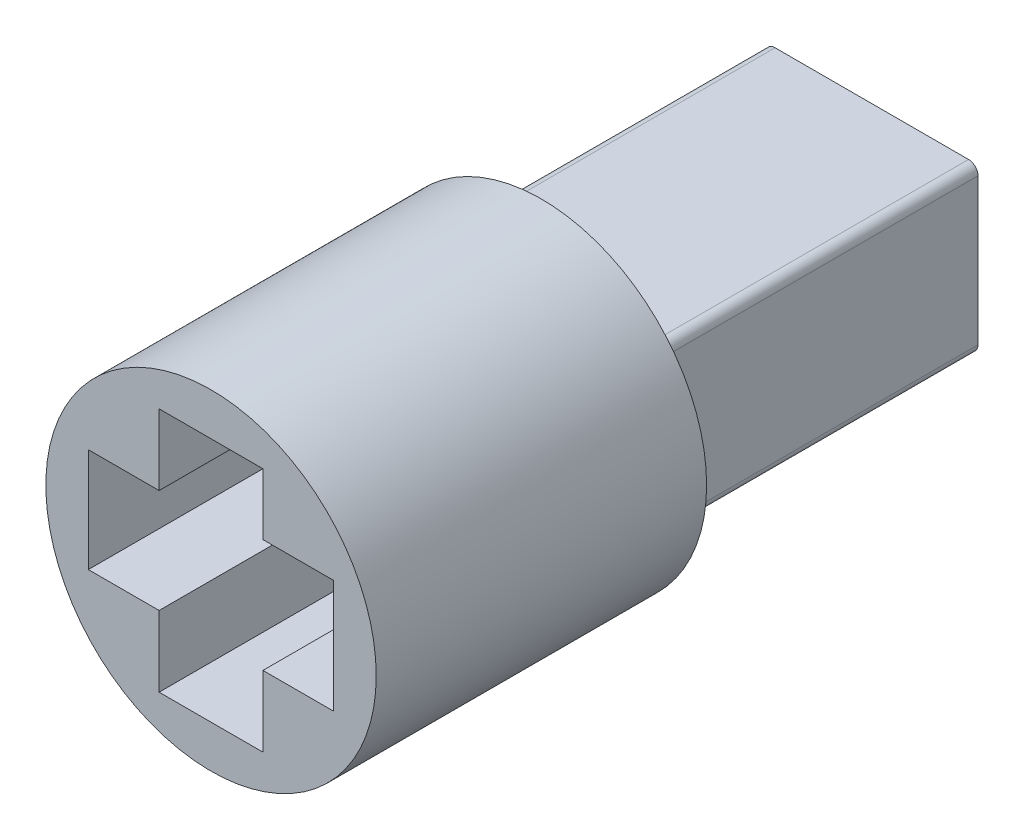
ISO-10303-21;
HEADER;
FILE_DESCRIPTION(('STEP AP214'),'2;1');
FILE_NAME('part.step','',(''),(''),'','','');
FILE_SCHEMA(('AUTOMOTIVE_DESIGN { 1 0 10303 214 1 1 1 1 }'));
ENDSEC;
DATA;
#1=APPLICATION_CONTEXT('core data for automotive mechanical design processes');
#2=APPLICATION_PROTOCOL_DEFINITION('international standard','automotive_design',2000,#1);
#3=PRODUCT_CONTEXT('',#1,'mechanical');
#4=PRODUCT('Part','Part','',(#3));
#5=PRODUCT_RELATED_PRODUCT_CATEGORY('part','',(#4));
#6=PRODUCT_DEFINITION_FORMATION('','',#4);
#7=PRODUCT_DEFINITION_CONTEXT('part definition',#1,'design');
#8=PRODUCT_DEFINITION('design','',#6,#7);
#9=PRODUCT_DEFINITION_SHAPE('','',#8);
#10=(LENGTH_UNIT() NAMED_UNIT(*) SI_UNIT(.MILLI.,.METRE.));
#11=(NAMED_UNIT(*) PLANE_ANGLE_UNIT() SI_UNIT($,.RADIAN.));
#12=(NAMED_UNIT(*) SI_UNIT($,.STERADIAN.) SOLID_ANGLE_UNIT());
#13=UNCERTAINTY_MEASURE_WITH_UNIT(LENGTH_MEASURE(1.E-05),#10,'distance_accuracy_value','');
#14=(GEOMETRIC_REPRESENTATION_CONTEXT(3) GLOBAL_UNCERTAINTY_ASSIGNED_CONTEXT((#13)) GLOBAL_UNIT_ASSIGNED_CONTEXT((#10,
#11,#12)) REPRESENTATION_CONTEXT('',''));
#15=CARTESIAN_POINT('',(0.,0.,0.));
#16=DIRECTION('',(0.,0.,1.));
#17=DIRECTION('',(1.,0.,0.));
#18=AXIS2_PLACEMENT_3D('',#15,#16,#17);
#19=CARTESIAN_POINT('',(-4.5,0.,7.));
#20=DIRECTION('',(0.,1.,0.));
#21=DIRECTION('',(-1.,0.,0.));
#22=AXIS2_PLACEMENT_3D('',#19,#20,#21);
#23=PLANE('',#22);
#24=DIRECTION('',(1.,0.,0.));
#25=VECTOR('',#24,1.);
#26=CARTESIAN_POINT('',(-4.5,0.,7.));
#27=LINE('',#26,#25);
#28=CARTESIAN_POINT('',(-4.3,0.,7.));
#29=VERTEX_POINT('',#28);
#30=CARTESIAN_POINT('',(-0.2,0.,7.));
#31=VERTEX_POINT('',#30);
#32=EDGE_CURVE('E289',#29,#31,#27,.T.);
#33=ORIENTED_EDGE('',*,*,#32,.F.);
#34=DIRECTION('',(0.,0.,-1.));
#35=VECTOR('',#34,1.);
#36=CARTESIAN_POINT('',(-4.3,0.,7.));
#37=LINE('',#36,#35);
#38=CARTESIAN_POINT('',(-4.3,0.,0.));
#39=VERTEX_POINT('',#38);
#40=EDGE_CURVE('E320',#29,#39,#37,.T.);
#41=ORIENTED_EDGE('',*,*,#40,.T.);
#42=DIRECTION('',(1.,0.,0.));
#43=VECTOR('',#42,1.);
#44=CARTESIAN_POINT('',(-4.5,0.,0.));
#45=LINE('',#44,#43);
#46=CARTESIAN_POINT('',(-0.2,0.,0.));
#47=VERTEX_POINT('',#46);
#48=EDGE_CURVE('E281',#39,#47,#45,.T.);
#49=ORIENTED_EDGE('',*,*,#48,.T.);
#50=DIRECTION('',(0.,0.,-1.));
#51=VECTOR('',#50,1.);
#52=CARTESIAN_POINT('',(-0.2,0.,7.));
#53=LINE('',#52,#51);
#54=EDGE_CURVE('E312',#47,#31,#53,.F.);
#55=ORIENTED_EDGE('',*,*,#54,.T.);
#56=EDGE_LOOP('',(#33,#41,#49,#55));
#57=FACE_BOUND('',#56,.T.);
#58=ADVANCED_FACE('F39',(#57),#23,.F.);
#59=CARTESIAN_POINT('',(0.,0.,7.));
#60=DIRECTION('',(-1.,0.,0.));
#61=DIRECTION('',(0.,0.,1.));
#62=AXIS2_PLACEMENT_3D('',#59,#60,#61);
#63=PLANE('',#62);
#64=DIRECTION('',(0.,1.,0.));
#65=VECTOR('',#64,1.);
#66=CARTESIAN_POINT('',(0.,0.,7.));
#67=LINE('',#66,#65);
#68=CARTESIAN_POINT('',(0.,0.2,7.));
#69=VERTEX_POINT('',#68);
#70=CARTESIAN_POINT('',(0.,3.3,7.));
#71=VERTEX_POINT('',#70);
#72=EDGE_CURVE('E290',#69,#71,#67,.T.);
#73=ORIENTED_EDGE('',*,*,#72,.F.);
#74=DIRECTION('',(0.,0.,-1.));
#75=VECTOR('',#74,1.);
#76=CARTESIAN_POINT('',(0.,0.2,7.));
#77=LINE('',#76,#75);
#78=CARTESIAN_POINT('',(0.,0.2,0.));
#79=VERTEX_POINT('',#78);
#80=EDGE_CURVE('E332',#69,#79,#77,.T.);
#81=ORIENTED_EDGE('',*,*,#80,.T.);
#82=DIRECTION('',(0.,1.,0.));
#83=VECTOR('',#82,1.);
#84=CARTESIAN_POINT('',(0.,0.,0.));
#85=LINE('',#84,#83);
#86=CARTESIAN_POINT('',(0.,3.3,0.));
#87=VERTEX_POINT('',#86);
#88=EDGE_CURVE('E297',#79,#87,#85,.T.);
#89=ORIENTED_EDGE('',*,*,#88,.T.);
#90=DIRECTION('',(0.,0.,-1.));
#91=VECTOR('',#90,1.);
#92=CARTESIAN_POINT('',(0.,3.3,7.));
#93=LINE('',#92,#91);
#94=EDGE_CURVE('E309',#87,#71,#93,.F.);
#95=ORIENTED_EDGE('',*,*,#94,.T.);
#96=EDGE_LOOP('',(#73,#81,#89,#95));
#97=FACE_BOUND('',#96,.T.);
#98=ADVANCED_FACE('F365',(#97),#63,.F.);
#99=CARTESIAN_POINT('',(0.,3.5,7.));
#100=DIRECTION('',(0.,-1.,0.));
#101=DIRECTION('',(0.,0.,-1.));
#102=AXIS2_PLACEMENT_3D('',#99,#100,#101);
#103=PLANE('',#102);
#104=DIRECTION('',(-1.,0.,0.));
#105=VECTOR('',#104,1.);
#106=CARTESIAN_POINT('',(0.,3.5,0.));
#107=LINE('',#106,#105);
#108=CARTESIAN_POINT('',(-0.2,3.5,0.));
#109=VERTEX_POINT('',#108);
#110=CARTESIAN_POINT('',(-4.3,3.5,0.));
#111=VERTEX_POINT('',#110);
#112=EDGE_CURVE('E304',#109,#111,#107,.T.);
#113=ORIENTED_EDGE('',*,*,#112,.T.);
#114=DIRECTION('',(0.,0.,-1.));
#115=VECTOR('',#114,1.);
#116=CARTESIAN_POINT('',(-4.3,3.5,7.));
#117=LINE('',#116,#115);
#118=CARTESIAN_POINT('',(-4.3,3.5,7.));
#119=VERTEX_POINT('',#118);
#120=EDGE_CURVE('E53',#111,#119,#117,.F.);
#121=ORIENTED_EDGE('',*,*,#120,.T.);
#122=DIRECTION('',(-1.,0.,0.));
#123=VECTOR('',#122,1.);
#124=CARTESIAN_POINT('',(0.,3.5,7.));
#125=LINE('',#124,#123);
#126=CARTESIAN_POINT('',(-0.2,3.5,7.));
#127=VERTEX_POINT('',#126);
#128=EDGE_CURVE('E292',#127,#119,#125,.T.);
#129=ORIENTED_EDGE('',*,*,#128,.F.);
#130=DIRECTION('',(0.,0.,-1.));
#131=VECTOR('',#130,1.);
#132=CARTESIAN_POINT('',(-0.2,3.5,7.));
#133=LINE('',#132,#131);
#134=EDGE_CURVE('E298',#127,#109,#133,.T.);
#135=ORIENTED_EDGE('',*,*,#134,.T.);
#136=EDGE_LOOP('',(#113,#121,#129,#135));
#137=FACE_BOUND('',#136,.T.);
#138=ADVANCED_FACE('F359',(#137),#103,.F.);
#139=CARTESIAN_POINT('',(-4.5,3.5,7.));
#140=DIRECTION('',(1.,0.,0.));
#141=DIRECTION('',(0.,0.,-1.));
#142=AXIS2_PLACEMENT_3D('',#139,#140,#141);
#143=PLANE('',#142);
#144=DIRECTION('',(0.,-1.,0.));
#145=VECTOR('',#144,1.);
#146=CARTESIAN_POINT('',(-4.5,3.5,0.));
#147=LINE('',#146,#145);
#148=CARTESIAN_POINT('',(-4.5,3.3,0.));
#149=VERTEX_POINT('',#148);
#150=CARTESIAN_POINT('',(-4.5,0.2,0.));
#151=VERTEX_POINT('',#150);
#152=EDGE_CURVE('E288',#149,#151,#147,.T.);
#153=ORIENTED_EDGE('',*,*,#152,.T.);
#154=DIRECTION('',(0.,0.,-1.));
#155=VECTOR('',#154,1.);
#156=CARTESIAN_POINT('',(-4.5,0.2,7.));
#157=LINE('',#156,#155);
#158=CARTESIAN_POINT('',(-4.5,0.2,7.));
#159=VERTEX_POINT('',#158);
#160=EDGE_CURVE('E328',#151,#159,#157,.F.);
#161=ORIENTED_EDGE('',*,*,#160,.T.);
#162=DIRECTION('',(0.,-1.,0.));
#163=VECTOR('',#162,1.);
#164=CARTESIAN_POINT('',(-4.5,3.5,7.));
#165=LINE('',#164,#163);
#166=CARTESIAN_POINT('',(-4.5,3.3,7.));
#167=VERTEX_POINT('',#166);
#168=EDGE_CURVE('E291',#167,#159,#165,.T.);
#169=ORIENTED_EDGE('',*,*,#168,.F.);
#170=DIRECTION('',(0.,0.,-1.));
#171=VECTOR('',#170,1.);
#172=CARTESIAN_POINT('',(-4.5,3.3,7.));
#173=LINE('',#172,#171);
#174=EDGE_CURVE('E326',#167,#149,#173,.T.);
#175=ORIENTED_EDGE('',*,*,#174,.T.);
#176=EDGE_LOOP('',(#153,#161,#169,#175));
#177=FACE_BOUND('',#176,.T.);
#178=ADVANCED_FACE('F353',(#177),#143,.F.);
#179=CARTESIAN_POINT('',(0.,0.,0.));
#180=DIRECTION('',(0.,0.,1.));
#181=DIRECTION('',(1.,0.,0.));
#182=AXIS2_PLACEMENT_3D('',#179,#180,#181);
#183=PLANE('',#182);
#184=ORIENTED_EDGE('',*,*,#48,.F.);
#185=CARTESIAN_POINT('',(-4.3,0.2,0.));
#186=DIRECTION('',(0.,0.,1.));
#187=DIRECTION('',(1.,0.,0.));
#188=AXIS2_PLACEMENT_3D('',#185,#186,#187);
#189=CIRCLE('',#188,0.2);
#190=EDGE_CURVE('E322',#39,#151,#189,.F.);
#191=ORIENTED_EDGE('',*,*,#190,.T.);
#192=ORIENTED_EDGE('',*,*,#152,.F.);
#193=CARTESIAN_POINT('',(-4.3,3.3,0.));
#194=DIRECTION('',(0.,0.,1.));
#195=DIRECTION('',(1.,0.,0.));
#196=AXIS2_PLACEMENT_3D('',#193,#194,#195);
#197=CIRCLE('',#196,0.2);
#198=EDGE_CURVE('E319',#149,#111,#197,.F.);
#199=ORIENTED_EDGE('',*,*,#198,.T.);
#200=ORIENTED_EDGE('',*,*,#112,.F.);
#201=CARTESIAN_POINT('',(-0.2,3.3,0.));
#202=DIRECTION('',(0.,0.,1.));
#203=DIRECTION('',(1.,0.,0.));
#204=AXIS2_PLACEMENT_3D('',#201,#202,#203);
#205=CIRCLE('',#204,0.2);
#206=EDGE_CURVE('E307',#109,#87,#205,.F.);
#207=ORIENTED_EDGE('',*,*,#206,.T.);
#208=ORIENTED_EDGE('',*,*,#88,.F.);
#209=CARTESIAN_POINT('',(-0.2,0.2,0.));
#210=DIRECTION('',(0.,0.,1.));
#211=DIRECTION('',(1.,0.,0.));
#212=AXIS2_PLACEMENT_3D('',#209,#210,#211);
#213=CIRCLE('',#212,0.2);
#214=EDGE_CURVE('E325',#79,#47,#213,.F.);
#215=ORIENTED_EDGE('',*,*,#214,.T.);
#216=EDGE_LOOP('',(#184,#191,#192,#199,#200,#207,#208,#215));
#217=FACE_BOUND('',#216,.T.);
#218=ADVANCED_FACE('F349',(#217),#183,.F.);
#219=CARTESIAN_POINT('',(-2.25,1.75,7.));
#220=DIRECTION('',(0.,0.,1.));
#221=DIRECTION('',(1.,0.,0.));
#222=AXIS2_PLACEMENT_3D('',#219,#220,#221);
#223=PLANE('',#222);
#224=CARTESIAN_POINT('',(-2.25,1.75,7.));
#225=DIRECTION('',(0.,0.,1.));
#226=DIRECTION('',(1.,0.,0.));
#227=AXIS2_PLACEMENT_3D('',#224,#225,#226);
#228=CIRCLE('',#227,3.5);
#229=CARTESIAN_POINT('',(1.25,1.75,7.));
#230=VERTEX_POINT('',#229);
#231=EDGE_CURVE('E257',#230,#230,#228,.T.);
#232=ORIENTED_EDGE('',*,*,#231,.F.);
#233=EDGE_LOOP('',(#232));
#234=FACE_BOUND('',#233,.T.);
#235=ORIENTED_EDGE('',*,*,#128,.T.);
#236=CARTESIAN_POINT('',(-4.3,3.3,7.));
#237=DIRECTION('',(0.,0.,1.));
#238=DIRECTION('',(1.,0.,0.));
#239=AXIS2_PLACEMENT_3D('',#236,#237,#238);
#240=CIRCLE('',#239,0.2);
#241=EDGE_CURVE('E11',#119,#167,#240,.T.);
#242=ORIENTED_EDGE('',*,*,#241,.T.);
#243=ORIENTED_EDGE('',*,*,#168,.T.);
#244=CARTESIAN_POINT('',(-4.3,0.2,7.));
#245=DIRECTION('',(0.,0.,1.));
#246=DIRECTION('',(1.,0.,0.));
#247=AXIS2_PLACEMENT_3D('',#244,#245,#246);
#248=CIRCLE('',#247,0.2);
#249=EDGE_CURVE('E333',#159,#29,#248,.T.);
#250=ORIENTED_EDGE('',*,*,#249,.T.);
#251=ORIENTED_EDGE('',*,*,#32,.T.);
#252=CARTESIAN_POINT('',(-0.2,0.2,7.));
#253=DIRECTION('',(0.,0.,1.));
#254=DIRECTION('',(1.,0.,0.));
#255=AXIS2_PLACEMENT_3D('',#252,#253,#254);
#256=CIRCLE('',#255,0.2);
#257=EDGE_CURVE('E50',#31,#69,#256,.T.);
#258=ORIENTED_EDGE('',*,*,#257,.T.);
#259=ORIENTED_EDGE('',*,*,#72,.T.);
#260=CARTESIAN_POINT('',(-0.2,3.3,7.));
#261=DIRECTION('',(0.,0.,1.));
#262=DIRECTION('',(1.,0.,0.));
#263=AXIS2_PLACEMENT_3D('',#260,#261,#262);
#264=CIRCLE('',#263,0.2);
#265=EDGE_CURVE('E311',#71,#127,#264,.T.);
#266=ORIENTED_EDGE('',*,*,#265,.T.);
#267=EDGE_LOOP('',(#235,#242,#243,#250,#251,#258,#259,#266));
#268=FACE_BOUND('',#267,.T.);
#269=ADVANCED_FACE('F336',(#234,#268),#223,.F.);
#270=CARTESIAN_POINT('',(-2.25,1.75,14.));
#271=DIRECTION('',(0.,0.,-1.));
#272=DIRECTION('',(-1.,0.,0.));
#273=AXIS2_PLACEMENT_3D('',#270,#271,#272);
#274=CYLINDRICAL_SURFACE('',#273,3.5);
#275=CARTESIAN_POINT('',(-2.25,1.75,14.));
#276=DIRECTION('',(0.,0.,1.));
#277=DIRECTION('',(1.,0.,0.));
#278=AXIS2_PLACEMENT_3D('',#275,#276,#277);
#279=CIRCLE('',#278,3.5);
#280=CARTESIAN_POINT('',(1.25,1.75,14.));
#281=VERTEX_POINT('',#280);
#282=EDGE_CURVE('E278',#281,#281,#279,.T.);
#283=ORIENTED_EDGE('',*,*,#282,.F.);
#284=EDGE_LOOP('',(#283));
#285=FACE_BOUND('',#284,.T.);
#286=ORIENTED_EDGE('',*,*,#231,.T.);
#287=EDGE_LOOP('',(#286));
#288=FACE_BOUND('',#287,.T.);
#289=ADVANCED_FACE('F440',(#285,#288),#274,.T.);
#290=CARTESIAN_POINT('',(-2.25,1.75,14.));
#291=DIRECTION('',(0.,0.,1.));
#292=DIRECTION('',(1.,0.,0.));
#293=AXIS2_PLACEMENT_3D('',#290,#291,#292);
#294=PLANE('',#293);
#295=DIRECTION('',(1.,0.,0.));
#296=VECTOR('',#295,1.);
#297=CARTESIAN_POINT('',(-1.15,0.650000000000004,14.));
#298=LINE('',#297,#296);
#299=CARTESIAN_POINT('',(-1.15,0.650000000000004,14.));
#300=VERTEX_POINT('',#299);
#301=CARTESIAN_POINT('',(0.350000000000005,0.650000000000009,14.));
#302=VERTEX_POINT('',#301);
#303=EDGE_CURVE('E181',#300,#302,#298,.T.);
#304=ORIENTED_EDGE('',*,*,#303,.F.);
#305=DIRECTION('',(0.,-1.,0.));
#306=VECTOR('',#305,1.);
#307=CARTESIAN_POINT('',(-1.15,0.650000000000004,14.));
#308=LINE('',#307,#306);
#309=CARTESIAN_POINT('',(-1.14999999999999,-0.849999999999997,14.));
#310=VERTEX_POINT('',#309);
#311=EDGE_CURVE('E203',#300,#310,#308,.T.);
#312=ORIENTED_EDGE('',*,*,#311,.T.);
#313=DIRECTION('',(1.,0.,0.));
#314=VECTOR('',#313,1.);
#315=CARTESIAN_POINT('',(-3.35,-0.850000000000001,14.));
#316=LINE('',#315,#314);
#317=CARTESIAN_POINT('',(-3.35,-0.850000000000001,14.));
#318=VERTEX_POINT('',#317);
#319=EDGE_CURVE('E204',#318,#310,#316,.T.);
#320=ORIENTED_EDGE('',*,*,#319,.F.);
#321=DIRECTION('',(0.,-1.,0.));
#322=VECTOR('',#321,1.);
#323=CARTESIAN_POINT('',(-3.35,0.650000000000004,14.));
#324=LINE('',#323,#322);
#325=CARTESIAN_POINT('',(-3.35,0.650000000000004,14.));
#326=VERTEX_POINT('',#325);
#327=EDGE_CURVE('E251',#326,#318,#324,.T.);
#328=ORIENTED_EDGE('',*,*,#327,.F.);
#329=DIRECTION('',(1.,0.,0.));
#330=VECTOR('',#329,1.);
#331=CARTESIAN_POINT('',(-4.85,0.650000000000004,14.));
#332=LINE('',#331,#330);
#333=CARTESIAN_POINT('',(-4.85,0.650000000000004,14.));
#334=VERTEX_POINT('',#333);
#335=EDGE_CURVE('E247',#334,#326,#332,.T.);
#336=ORIENTED_EDGE('',*,*,#335,.F.);
#337=DIRECTION('',(0.,-1.,0.));
#338=VECTOR('',#337,1.);
#339=CARTESIAN_POINT('',(-4.85,2.85,14.));
#340=LINE('',#339,#338);
#341=CARTESIAN_POINT('',(-4.85,2.85,14.));
#342=VERTEX_POINT('',#341);
#343=EDGE_CURVE('E246',#342,#334,#340,.T.);
#344=ORIENTED_EDGE('',*,*,#343,.F.);
#345=DIRECTION('',(-1.,0.,0.));
#346=VECTOR('',#345,1.);
#347=CARTESIAN_POINT('',(-3.35,2.85,14.));
#348=LINE('',#347,#346);
#349=CARTESIAN_POINT('',(-3.35,2.85,14.));
#350=VERTEX_POINT('',#349);
#351=EDGE_CURVE('E242',#350,#342,#348,.T.);
#352=ORIENTED_EDGE('',*,*,#351,.F.);
#353=DIRECTION('',(0.,1.,0.));
#354=VECTOR('',#353,1.);
#355=CARTESIAN_POINT('',(-3.35,2.85,14.));
#356=LINE('',#355,#354);
#357=CARTESIAN_POINT('',(-3.35,4.35,14.));
#358=VERTEX_POINT('',#357);
#359=EDGE_CURVE('E243',#350,#358,#356,.T.);
#360=ORIENTED_EDGE('',*,*,#359,.T.);
#361=DIRECTION('',(1.,0.,0.));
#362=VECTOR('',#361,1.);
#363=CARTESIAN_POINT('',(-3.35,4.35,14.));
#364=LINE('',#363,#362);
#365=CARTESIAN_POINT('',(-1.15,4.35,14.));
#366=VERTEX_POINT('',#365);
#367=EDGE_CURVE('E236',#358,#366,#364,.T.);
#368=ORIENTED_EDGE('',*,*,#367,.T.);
#369=DIRECTION('',(0.,-1.,0.));
#370=VECTOR('',#369,1.);
#371=CARTESIAN_POINT('',(-1.15,4.35,14.));
#372=LINE('',#371,#370);
#373=CARTESIAN_POINT('',(-1.15,3.05,14.));
#374=VERTEX_POINT('',#373);
#375=EDGE_CURVE('E232',#366,#374,#372,.T.);
#376=ORIENTED_EDGE('',*,*,#375,.T.);
#377=DIRECTION('',(1.,0.,0.));
#378=VECTOR('',#377,1.);
#379=CARTESIAN_POINT('',(-1.15,3.05,14.));
#380=LINE('',#379,#378);
#381=CARTESIAN_POINT('',(0.350000000000001,3.05,14.));
#382=VERTEX_POINT('',#381);
#383=EDGE_CURVE('E231',#374,#382,#380,.T.);
#384=ORIENTED_EDGE('',*,*,#383,.T.);
#385=DIRECTION('',(0.,1.,0.));
#386=VECTOR('',#385,1.);
#387=CARTESIAN_POINT('',(0.350000000000005,0.650000000000009,14.));
#388=LINE('',#387,#386);
#389=EDGE_CURVE('E229',#302,#382,#388,.T.);
#390=ORIENTED_EDGE('',*,*,#389,.F.);
#391=EDGE_LOOP('',(#304,#312,#320,#328,#336,#344,#352,#360,#368,#376,#384,#390));
#392=FACE_BOUND('',#391,.T.);
#393=ORIENTED_EDGE('',*,*,#282,.T.);
#394=EDGE_LOOP('',(#393));
#395=FACE_BOUND('',#394,.T.);
#396=ADVANCED_FACE('F432',(#392,#395),#294,.T.);
#397=CARTESIAN_POINT('',(-1.15,0.650000000000004,9.));
#398=DIRECTION('',(0.,-1.,0.));
#399=DIRECTION('',(1.,0.,0.));
#400=AXIS2_PLACEMENT_3D('',#397,#398,#399);
#401=PLANE('',#400);
#402=ORIENTED_EDGE('',*,*,#303,.T.);
#403=DIRECTION('',(0.,0.,1.));
#404=VECTOR('',#403,1.);
#405=CARTESIAN_POINT('',(0.350000000000005,0.650000000000009,9.));
#406=LINE('',#405,#404);
#407=CARTESIAN_POINT('',(0.350000000000005,0.650000000000009,9.));
#408=VERTEX_POINT('',#407);
#409=EDGE_CURVE('E176',#408,#302,#406,.T.);
#410=ORIENTED_EDGE('',*,*,#409,.F.);
#411=DIRECTION('',(1.,0.,0.));
#412=VECTOR('',#411,1.);
#413=CARTESIAN_POINT('',(-1.15,0.650000000000004,9.));
#414=LINE('',#413,#412);
#415=CARTESIAN_POINT('',(-1.15,0.650000000000004,9.));
#416=VERTEX_POINT('',#415);
#417=EDGE_CURVE('E182',#416,#408,#414,.T.);
#418=ORIENTED_EDGE('',*,*,#417,.F.);
#419=DIRECTION('',(0.,0.,1.));
#420=VECTOR('',#419,1.);
#421=CARTESIAN_POINT('',(-1.15,0.650000000000004,9.));
#422=LINE('',#421,#420);
#423=EDGE_CURVE('E256',#416,#300,#422,.T.);
#424=ORIENTED_EDGE('',*,*,#423,.T.);
#425=EDGE_LOOP('',(#402,#410,#418,#424));
#426=FACE_BOUND('',#425,.T.);
#427=ADVANCED_FACE('F178',(#426),#401,.F.);
#428=CARTESIAN_POINT('',(-1.15,0.650000000000004,9.));
#429=DIRECTION('',(-1.,0.,0.));
#430=DIRECTION('',(0.,-1.,0.));
#431=AXIS2_PLACEMENT_3D('',#428,#429,#430);
#432=PLANE('',#431);
#433=ORIENTED_EDGE('',*,*,#311,.F.);
#434=ORIENTED_EDGE('',*,*,#423,.F.);
#435=DIRECTION('',(0.,-1.,0.));
#436=VECTOR('',#435,1.);
#437=CARTESIAN_POINT('',(-1.15,0.650000000000004,9.));
#438=LINE('',#437,#436);
#439=CARTESIAN_POINT('',(-1.14999999999999,-0.849999999999997,9.));
#440=VERTEX_POINT('',#439);
#441=EDGE_CURVE('E186',#416,#440,#438,.T.);
#442=ORIENTED_EDGE('',*,*,#441,.T.);
#443=DIRECTION('',(0.,0.,1.));
#444=VECTOR('',#443,1.);
#445=CARTESIAN_POINT('',(-1.14999999999999,-0.849999999999997,9.));
#446=LINE('',#445,#444);
#447=EDGE_CURVE('E261',#440,#310,#446,.T.);
#448=ORIENTED_EDGE('',*,*,#447,.T.);
#449=EDGE_LOOP('',(#433,#434,#442,#448));
#450=FACE_BOUND('',#449,.T.);
#451=ADVANCED_FACE('F391',(#450),#432,.T.);
#452=CARTESIAN_POINT('',(-3.35,-0.850000000000001,9.));
#453=DIRECTION('',(0.,-1.,0.));
#454=DIRECTION('',(1.,0.,0.));
#455=AXIS2_PLACEMENT_3D('',#452,#453,#454);
#456=PLANE('',#455);
#457=ORIENTED_EDGE('',*,*,#319,.T.);
#458=ORIENTED_EDGE('',*,*,#447,.F.);
#459=DIRECTION('',(1.,0.,0.));
#460=VECTOR('',#459,1.);
#461=CARTESIAN_POINT('',(-3.35,-0.850000000000001,9.));
#462=LINE('',#461,#460);
#463=CARTESIAN_POINT('',(-3.35,-0.850000000000001,9.));
#464=VERTEX_POINT('',#463);
#465=EDGE_CURVE('E228',#464,#440,#462,.T.);
#466=ORIENTED_EDGE('',*,*,#465,.F.);
#467=DIRECTION('',(0.,0.,1.));
#468=VECTOR('',#467,1.);
#469=CARTESIAN_POINT('',(-3.35,-0.850000000000001,9.));
#470=LINE('',#469,#468);
#471=EDGE_CURVE('E263',#464,#318,#470,.T.);
#472=ORIENTED_EDGE('',*,*,#471,.T.);
#473=EDGE_LOOP('',(#457,#458,#466,#472));
#474=FACE_BOUND('',#473,.T.);
#475=ADVANCED_FACE('F399',(#474),#456,.F.);
#476=CARTESIAN_POINT('',(-3.35,0.650000000000004,9.));
#477=DIRECTION('',(-1.,0.,0.));
#478=DIRECTION('',(0.,0.,1.));
#479=AXIS2_PLACEMENT_3D('',#476,#477,#478);
#480=PLANE('',#479);
#481=ORIENTED_EDGE('',*,*,#327,.T.);
#482=ORIENTED_EDGE('',*,*,#471,.F.);
#483=DIRECTION('',(0.,-1.,0.));
#484=VECTOR('',#483,1.);
#485=CARTESIAN_POINT('',(-3.35,0.650000000000004,9.));
#486=LINE('',#485,#484);
#487=CARTESIAN_POINT('',(-3.35,0.650000000000004,9.));
#488=VERTEX_POINT('',#487);
#489=EDGE_CURVE('E224',#488,#464,#486,.T.);
#490=ORIENTED_EDGE('',*,*,#489,.F.);
#491=DIRECTION('',(0.,0.,1.));
#492=VECTOR('',#491,1.);
#493=CARTESIAN_POINT('',(-3.35,0.650000000000004,9.));
#494=LINE('',#493,#492);
#495=EDGE_CURVE('E264',#488,#326,#494,.T.);
#496=ORIENTED_EDGE('',*,*,#495,.T.);
#497=EDGE_LOOP('',(#481,#482,#490,#496));
#498=FACE_BOUND('',#497,.T.);
#499=ADVANCED_FACE('F397',(#498),#480,.F.);
#500=CARTESIAN_POINT('',(-4.85,0.650000000000004,9.));
#501=DIRECTION('',(0.,-1.,0.));
#502=DIRECTION('',(0.,0.,-1.));
#503=AXIS2_PLACEMENT_3D('',#500,#501,#502);
#504=PLANE('',#503);
#505=ORIENTED_EDGE('',*,*,#335,.T.);
#506=ORIENTED_EDGE('',*,*,#495,.F.);
#507=DIRECTION('',(1.,0.,0.));
#508=VECTOR('',#507,1.);
#509=CARTESIAN_POINT('',(-4.85,0.650000000000004,9.));
#510=LINE('',#509,#508);
#511=CARTESIAN_POINT('',(-4.85,0.650000000000004,9.));
#512=VERTEX_POINT('',#511);
#513=EDGE_CURVE('E219',#512,#488,#510,.T.);
#514=ORIENTED_EDGE('',*,*,#513,.F.);
#515=DIRECTION('',(0.,0.,1.));
#516=VECTOR('',#515,1.);
#517=CARTESIAN_POINT('',(-4.85,0.650000000000004,9.));
#518=LINE('',#517,#516);
#519=EDGE_CURVE('E270',#512,#334,#518,.T.);
#520=ORIENTED_EDGE('',*,*,#519,.T.);
#521=EDGE_LOOP('',(#505,#506,#514,#520));
#522=FACE_BOUND('',#521,.T.);
#523=ADVANCED_FACE('F404',(#522),#504,.F.);
#524=CARTESIAN_POINT('',(-4.85,2.85,9.));
#525=DIRECTION('',(-1.,0.,0.));
#526=DIRECTION('',(0.,0.,1.));
#527=AXIS2_PLACEMENT_3D('',#524,#525,#526);
#528=PLANE('',#527);
#529=ORIENTED_EDGE('',*,*,#343,.T.);
#530=ORIENTED_EDGE('',*,*,#519,.F.);
#531=DIRECTION('',(0.,-1.,0.));
#532=VECTOR('',#531,1.);
#533=CARTESIAN_POINT('',(-4.85,2.85,9.));
#534=LINE('',#533,#532);
#535=CARTESIAN_POINT('',(-4.85,2.85,9.));
#536=VERTEX_POINT('',#535);
#537=EDGE_CURVE('E220',#536,#512,#534,.T.);
#538=ORIENTED_EDGE('',*,*,#537,.F.);
#539=DIRECTION('',(0.,0.,1.));
#540=VECTOR('',#539,1.);
#541=CARTESIAN_POINT('',(-4.85,2.85,9.));
#542=LINE('',#541,#540);
#543=EDGE_CURVE('E267',#536,#342,#542,.T.);
#544=ORIENTED_EDGE('',*,*,#543,.T.);
#545=EDGE_LOOP('',(#529,#530,#538,#544));
#546=FACE_BOUND('',#545,.T.);
#547=ADVANCED_FACE('F406',(#546),#528,.F.);
#548=CARTESIAN_POINT('',(-3.35,2.85,9.));
#549=DIRECTION('',(0.,1.,0.));
#550=DIRECTION('',(0.,0.,1.));
#551=AXIS2_PLACEMENT_3D('',#548,#549,#550);
#552=PLANE('',#551);
#553=ORIENTED_EDGE('',*,*,#351,.T.);
#554=ORIENTED_EDGE('',*,*,#543,.F.);
#555=DIRECTION('',(-1.,0.,0.));
#556=VECTOR('',#555,1.);
#557=CARTESIAN_POINT('',(-3.35,2.85,9.));
#558=LINE('',#557,#556);
#559=CARTESIAN_POINT('',(-3.35,2.85,9.));
#560=VERTEX_POINT('',#559);
#561=EDGE_CURVE('E212',#560,#536,#558,.T.);
#562=ORIENTED_EDGE('',*,*,#561,.F.);
#563=DIRECTION('',(0.,0.,1.));
#564=VECTOR('',#563,1.);
#565=CARTESIAN_POINT('',(-3.35,2.85,9.));
#566=LINE('',#565,#564);
#567=EDGE_CURVE('E271',#560,#350,#566,.T.);
#568=ORIENTED_EDGE('',*,*,#567,.T.);
#569=EDGE_LOOP('',(#553,#554,#562,#568));
#570=FACE_BOUND('',#569,.T.);
#571=ADVANCED_FACE('F411',(#570),#552,.F.);
#572=CARTESIAN_POINT('',(-3.35,2.85,9.));
#573=DIRECTION('',(1.,0.,0.));
#574=DIRECTION('',(0.,0.,-1.));
#575=AXIS2_PLACEMENT_3D('',#572,#573,#574);
#576=PLANE('',#575);
#577=ORIENTED_EDGE('',*,*,#359,.F.);
#578=ORIENTED_EDGE('',*,*,#567,.F.);
#579=DIRECTION('',(0.,1.,0.));
#580=VECTOR('',#579,1.);
#581=CARTESIAN_POINT('',(-3.35,2.85,9.));
#582=LINE('',#581,#580);
#583=CARTESIAN_POINT('',(-3.35,4.35,9.));
#584=VERTEX_POINT('',#583);
#585=EDGE_CURVE('E215',#560,#584,#582,.T.);
#586=ORIENTED_EDGE('',*,*,#585,.T.);
#587=DIRECTION('',(0.,0.,1.));
#588=VECTOR('',#587,1.);
#589=CARTESIAN_POINT('',(-3.35,4.35,9.));
#590=LINE('',#589,#588);
#591=EDGE_CURVE('E272',#584,#358,#590,.T.);
#592=ORIENTED_EDGE('',*,*,#591,.T.);
#593=EDGE_LOOP('',(#577,#578,#586,#592));
#594=FACE_BOUND('',#593,.T.);
#595=ADVANCED_FACE('F418',(#594),#576,.T.);
#596=CARTESIAN_POINT('',(-3.35,4.35,9.));
#597=DIRECTION('',(0.,-1.,0.));
#598=DIRECTION('',(0.,0.,-1.));
#599=AXIS2_PLACEMENT_3D('',#596,#597,#598);
#600=PLANE('',#599);
#601=ORIENTED_EDGE('',*,*,#367,.F.);
#602=ORIENTED_EDGE('',*,*,#591,.F.);
#603=DIRECTION('',(1.,0.,0.));
#604=VECTOR('',#603,1.);
#605=CARTESIAN_POINT('',(-3.35,4.35,9.));
#606=LINE('',#605,#604);
#607=CARTESIAN_POINT('',(-1.15,4.35,9.));
#608=VERTEX_POINT('',#607);
#609=EDGE_CURVE('E209',#584,#608,#606,.T.);
#610=ORIENTED_EDGE('',*,*,#609,.T.);
#611=DIRECTION('',(0.,0.,1.));
#612=VECTOR('',#611,1.);
#613=CARTESIAN_POINT('',(-1.15,4.35,9.));
#614=LINE('',#613,#612);
#615=EDGE_CURVE('E274',#608,#366,#614,.T.);
#616=ORIENTED_EDGE('',*,*,#615,.T.);
#617=EDGE_LOOP('',(#601,#602,#610,#616));
#618=FACE_BOUND('',#617,.T.);
#619=ADVANCED_FACE('F419',(#618),#600,.T.);
#620=CARTESIAN_POINT('',(-1.15,4.35,9.));
#621=DIRECTION('',(-1.,0.,0.));
#622=DIRECTION('',(0.,0.,1.));
#623=AXIS2_PLACEMENT_3D('',#620,#621,#622);
#624=PLANE('',#623);
#625=ORIENTED_EDGE('',*,*,#375,.F.);
#626=ORIENTED_EDGE('',*,*,#615,.F.);
#627=DIRECTION('',(0.,-1.,0.));
#628=VECTOR('',#627,1.);
#629=CARTESIAN_POINT('',(-1.15,4.35,9.));
#630=LINE('',#629,#628);
#631=CARTESIAN_POINT('',(-1.15,3.05,9.));
#632=VERTEX_POINT('',#631);
#633=EDGE_CURVE('E208',#608,#632,#630,.T.);
#634=ORIENTED_EDGE('',*,*,#633,.T.);
#635=DIRECTION('',(0.,0.,1.));
#636=VECTOR('',#635,1.);
#637=CARTESIAN_POINT('',(-1.15,3.05,9.));
#638=LINE('',#637,#636);
#639=EDGE_CURVE('E280',#632,#374,#638,.T.);
#640=ORIENTED_EDGE('',*,*,#639,.T.);
#641=EDGE_LOOP('',(#625,#626,#634,#640));
#642=FACE_BOUND('',#641,.T.);
#643=ADVANCED_FACE('F424',(#642),#624,.T.);
#644=CARTESIAN_POINT('',(-1.15,3.05,9.));
#645=DIRECTION('',(0.,-1.,0.));
#646=DIRECTION('',(0.,0.,-1.));
#647=AXIS2_PLACEMENT_3D('',#644,#645,#646);
#648=PLANE('',#647);
#649=ORIENTED_EDGE('',*,*,#383,.F.);
#650=ORIENTED_EDGE('',*,*,#639,.F.);
#651=DIRECTION('',(1.,0.,0.));
#652=VECTOR('',#651,1.);
#653=CARTESIAN_POINT('',(-1.15,3.05,9.));
#654=LINE('',#653,#652);
#655=CARTESIAN_POINT('',(0.350000000000001,3.05,9.));
#656=VERTEX_POINT('',#655);
#657=EDGE_CURVE('E198',#632,#656,#654,.T.);
#658=ORIENTED_EDGE('',*,*,#657,.T.);
#659=DIRECTION('',(0.,0.,1.));
#660=VECTOR('',#659,1.);
#661=CARTESIAN_POINT('',(0.350000000000001,3.05,9.));
#662=LINE('',#661,#660);
#663=EDGE_CURVE('E190',#656,#382,#662,.T.);
#664=ORIENTED_EDGE('',*,*,#663,.T.);
#665=EDGE_LOOP('',(#649,#650,#658,#664));
#666=FACE_BOUND('',#665,.T.);
#667=ADVANCED_FACE('F388',(#666),#648,.T.);
#668=CARTESIAN_POINT('',(0.350000000000005,0.650000000000009,9.));
#669=DIRECTION('',(1.,0.,0.));
#670=DIRECTION('',(0.,1.,0.));
#671=AXIS2_PLACEMENT_3D('',#668,#669,#670);
#672=PLANE('',#671);
#673=ORIENTED_EDGE('',*,*,#389,.T.);
#674=ORIENTED_EDGE('',*,*,#663,.F.);
#675=DIRECTION('',(0.,1.,0.));
#676=VECTOR('',#675,1.);
#677=CARTESIAN_POINT('',(0.350000000000005,0.650000000000009,9.));
#678=LINE('',#677,#676);
#679=EDGE_CURVE('E191',#408,#656,#678,.T.);
#680=ORIENTED_EDGE('',*,*,#679,.F.);
#681=ORIENTED_EDGE('',*,*,#409,.T.);
#682=EDGE_LOOP('',(#673,#674,#680,#681));
#683=FACE_BOUND('',#682,.T.);
#684=ADVANCED_FACE('F195',(#683),#672,.F.);
#685=CARTESIAN_POINT('',(0.,0.,9.));
#686=DIRECTION('',(0.,0.,1.));
#687=DIRECTION('',(1.,0.,0.));
#688=AXIS2_PLACEMENT_3D('',#685,#686,#687);
#689=PLANE('',#688);
#690=ORIENTED_EDGE('',*,*,#417,.T.);
#691=ORIENTED_EDGE('',*,*,#679,.T.);
#692=ORIENTED_EDGE('',*,*,#657,.F.);
#693=ORIENTED_EDGE('',*,*,#633,.F.);
#694=ORIENTED_EDGE('',*,*,#609,.F.);
#695=ORIENTED_EDGE('',*,*,#585,.F.);
#696=ORIENTED_EDGE('',*,*,#561,.T.);
#697=ORIENTED_EDGE('',*,*,#537,.T.);
#698=ORIENTED_EDGE('',*,*,#513,.T.);
#699=ORIENTED_EDGE('',*,*,#489,.T.);
#700=ORIENTED_EDGE('',*,*,#465,.T.);
#701=ORIENTED_EDGE('',*,*,#441,.F.);
#702=EDGE_LOOP('',(#690,#691,#692,#693,#694,#695,#696,#697,#698,#699,#700,#701));
#703=FACE_BOUND('',#702,.T.);
#704=ADVANCED_FACE('F200',(#703),#689,.T.);
#705=CARTESIAN_POINT('',(-0.2,3.3,7.));
#706=DIRECTION('',(0.,0.,-1.));
#707=DIRECTION('',(-1.,0.,0.));
#708=AXIS2_PLACEMENT_3D('',#705,#706,#707);
#709=CYLINDRICAL_SURFACE('',#708,0.2);
#710=ORIENTED_EDGE('',*,*,#265,.F.);
#711=ORIENTED_EDGE('',*,*,#94,.F.);
#712=ORIENTED_EDGE('',*,*,#206,.F.);
#713=ORIENTED_EDGE('',*,*,#134,.F.);
#714=EDGE_LOOP('',(#710,#711,#712,#713));
#715=FACE_BOUND('',#714,.T.);
#716=ADVANCED_FACE('F357',(#715),#709,.T.);
#717=CARTESIAN_POINT('',(-4.3,0.2,7.));
#718=DIRECTION('',(0.,0.,-1.));
#719=DIRECTION('',(-1.,0.,0.));
#720=AXIS2_PLACEMENT_3D('',#717,#718,#719);
#721=CYLINDRICAL_SURFACE('',#720,0.2);
#722=ORIENTED_EDGE('',*,*,#249,.F.);
#723=ORIENTED_EDGE('',*,*,#160,.F.);
#724=ORIENTED_EDGE('',*,*,#190,.F.);
#725=ORIENTED_EDGE('',*,*,#40,.F.);
#726=EDGE_LOOP('',(#722,#723,#724,#725));
#727=FACE_BOUND('',#726,.T.);
#728=ADVANCED_FACE('F347',(#727),#721,.T.);
#729=CARTESIAN_POINT('',(-0.2,0.2,7.));
#730=DIRECTION('',(0.,0.,-1.));
#731=DIRECTION('',(-1.,0.,0.));
#732=AXIS2_PLACEMENT_3D('',#729,#730,#731);
#733=CYLINDRICAL_SURFACE('',#732,0.2);
#734=ORIENTED_EDGE('',*,*,#257,.F.);
#735=ORIENTED_EDGE('',*,*,#54,.F.);
#736=ORIENTED_EDGE('',*,*,#214,.F.);
#737=ORIENTED_EDGE('',*,*,#80,.F.);
#738=EDGE_LOOP('',(#734,#735,#736,#737));
#739=FACE_BOUND('',#738,.T.);
#740=ADVANCED_FACE('F370',(#739),#733,.T.);
#741=CARTESIAN_POINT('',(-4.3,3.3,7.));
#742=DIRECTION('',(0.,0.,-1.));
#743=DIRECTION('',(-1.,0.,0.));
#744=AXIS2_PLACEMENT_3D('',#741,#742,#743);
#745=CYLINDRICAL_SURFACE('',#744,0.2);
#746=ORIENTED_EDGE('',*,*,#241,.F.);
#747=ORIENTED_EDGE('',*,*,#120,.F.);
#748=ORIENTED_EDGE('',*,*,#198,.F.);
#749=ORIENTED_EDGE('',*,*,#174,.F.);
#750=EDGE_LOOP('',(#746,#747,#748,#749));
#751=FACE_BOUND('',#750,.T.);
#752=ADVANCED_FACE('F41',(#751),#745,.T.);
#753=CLOSED_SHELL('',(#58,#98,#138,#178,#218,#269,#289,#396,#427,#451,#475,#499,#523,#547,#571,
#595,#619,#643,#667,#684,#704,#716,#728,#740,#752));
#754=MANIFOLD_SOLID_BREP('B2',#753);
#755=ADVANCED_BREP_SHAPE_REPRESENTATION('',(#18,#754),#14);
#756=SHAPE_DEFINITION_REPRESENTATION(#9,#755);
ENDSEC;
END-ISO-10303-21;
